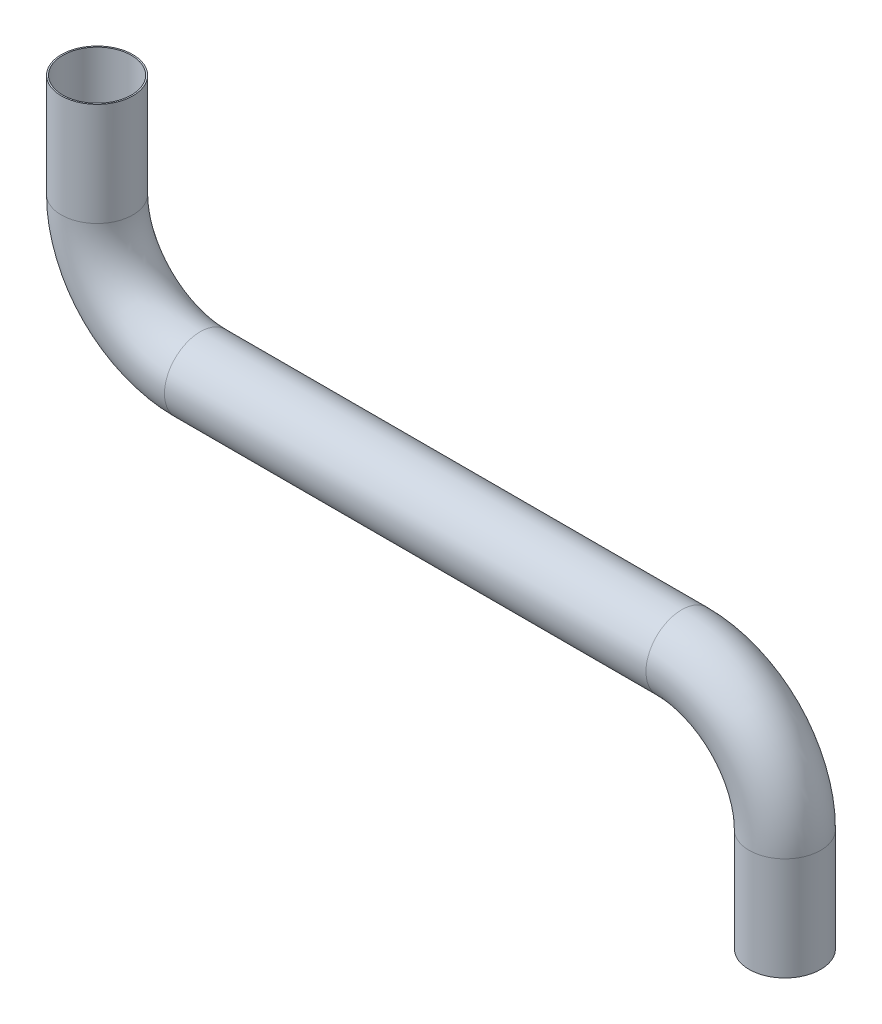
ISO-10303-21;
HEADER;
FILE_DESCRIPTION(('STEP AP214'),'2;1');
FILE_NAME('part.step','',(''),(''),'','','');
FILE_SCHEMA(('AUTOMOTIVE_DESIGN { 1 0 10303 214 1 1 1 1 }'));
ENDSEC;
DATA;
#1=APPLICATION_CONTEXT('core data for automotive mechanical design processes');
#2=APPLICATION_PROTOCOL_DEFINITION('international standard','automotive_design',2000,#1);
#3=PRODUCT_CONTEXT('',#1,'mechanical');
#4=PRODUCT('Part','Part','',(#3));
#5=PRODUCT_RELATED_PRODUCT_CATEGORY('part','',(#4));
#6=PRODUCT_DEFINITION_FORMATION('','',#4);
#7=PRODUCT_DEFINITION_CONTEXT('part definition',#1,'design');
#8=PRODUCT_DEFINITION('design','',#6,#7);
#9=PRODUCT_DEFINITION_SHAPE('','',#8);
#10=(LENGTH_UNIT() NAMED_UNIT(*) SI_UNIT(.MILLI.,.METRE.));
#11=(NAMED_UNIT(*) PLANE_ANGLE_UNIT() SI_UNIT($,.RADIAN.));
#12=(NAMED_UNIT(*) SI_UNIT($,.STERADIAN.) SOLID_ANGLE_UNIT());
#13=UNCERTAINTY_MEASURE_WITH_UNIT(LENGTH_MEASURE(1.E-05),#10,'distance_accuracy_value','');
#14=(GEOMETRIC_REPRESENTATION_CONTEXT(3) GLOBAL_UNCERTAINTY_ASSIGNED_CONTEXT((#13)) GLOBAL_UNIT_ASSIGNED_CONTEXT((#10,
#11,#12)) REPRESENTATION_CONTEXT('',''));
#15=CARTESIAN_POINT('',(0.,0.,0.));
#16=DIRECTION('',(0.,0.,1.));
#17=DIRECTION('',(1.,0.,0.));
#18=AXIS2_PLACEMENT_3D('',#15,#16,#17);
#19=CARTESIAN_POINT('',(0.,0.,0.));
#20=DIRECTION('',(0.,1.,0.));
#21=DIRECTION('',(0.,0.,1.));
#22=AXIS2_PLACEMENT_3D('',#19,#20,#21);
#23=PLANE('',#22);
#24=CARTESIAN_POINT('',(0.,0.,0.));
#25=DIRECTION('',(0.,1.,0.));
#26=DIRECTION('',(0.,0.,1.));
#27=AXIS2_PLACEMENT_3D('',#24,#25,#26);
#28=CIRCLE('',#27,25.);
#29=CARTESIAN_POINT('',(0.,0.,25.));
#30=VERTEX_POINT('',#29);
#31=EDGE_CURVE('E207',#30,#30,#28,.T.);
#32=ORIENTED_EDGE('',*,*,#31,.F.);
#33=EDGE_LOOP('',(#32));
#34=FACE_BOUND('',#33,.T.);
#35=CARTESIAN_POINT('',(0.,0.,0.));
#36=DIRECTION('',(0.,1.,0.));
#37=DIRECTION('',(0.,0.,1.));
#38=AXIS2_PLACEMENT_3D('',#35,#36,#37);
#39=CIRCLE('',#38,26.);
#40=CARTESIAN_POINT('',(0.,0.,26.));
#41=VERTEX_POINT('',#40);
#42=EDGE_CURVE('E61',#41,#41,#39,.T.);
#43=ORIENTED_EDGE('',*,*,#42,.T.);
#44=EDGE_LOOP('',(#43));
#45=FACE_BOUND('',#44,.T.);
#46=ADVANCED_FACE('F39',(#34,#45),#23,.T.);
#47=CARTESIAN_POINT('',(500.,-300.,0.));
#48=DIRECTION('',(0.,1.,0.));
#49=DIRECTION('',(0.,0.,1.));
#50=AXIS2_PLACEMENT_3D('',#47,#48,#49);
#51=PLANE('',#50);
#52=CARTESIAN_POINT('',(500.,-300.,0.));
#53=DIRECTION('',(0.,1.,0.));
#54=DIRECTION('',(0.,0.,1.));
#55=AXIS2_PLACEMENT_3D('',#52,#53,#54);
#56=CIRCLE('',#55,25.);
#57=CARTESIAN_POINT('',(500.,-300.,25.));
#58=VERTEX_POINT('',#57);
#59=EDGE_CURVE('E65',#58,#58,#56,.T.);
#60=ORIENTED_EDGE('',*,*,#59,.T.);
#61=EDGE_LOOP('',(#60));
#62=FACE_BOUND('',#61,.T.);
#63=CARTESIAN_POINT('',(500.,-300.,0.));
#64=DIRECTION('',(0.,1.,0.));
#65=DIRECTION('',(0.,0.,1.));
#66=AXIS2_PLACEMENT_3D('',#63,#64,#65);
#67=CIRCLE('',#66,26.);
#68=CARTESIAN_POINT('',(500.,-300.,26.));
#69=VERTEX_POINT('',#68);
#70=EDGE_CURVE('E10',#69,#69,#67,.T.);
#71=ORIENTED_EDGE('',*,*,#70,.F.);
#72=EDGE_LOOP('',(#71));
#73=FACE_BOUND('',#72,.T.);
#74=ADVANCED_FACE('F129',(#62,#73),#51,.F.);
#75=CARTESIAN_POINT('',(0.,0.,0.));
#76=DIRECTION('',(0.,-1.,0.));
#77=DIRECTION('',(0.,0.,-1.));
#78=AXIS2_PLACEMENT_3D('',#75,#76,#77);
#79=CYLINDRICAL_SURFACE('',#78,26.);
#80=CARTESIAN_POINT('',(0.,-74.9999999999995,0.));
#81=DIRECTION('',(0.,-1.,0.));
#82=DIRECTION('',(0.,0.,-1.));
#83=AXIS2_PLACEMENT_3D('',#80,#81,#82);
#84=CIRCLE('',#83,26.);
#85=CARTESIAN_POINT('',(-26.,-74.9999999999993,0.));
#86=VERTEX_POINT('',#85);
#87=EDGE_CURVE('E64',#86,#86,#84,.F.);
#88=ORIENTED_EDGE('',*,*,#87,.T.);
#89=EDGE_LOOP('',(#88));
#90=FACE_BOUND('',#89,.T.);
#91=ORIENTED_EDGE('',*,*,#42,.F.);
#92=EDGE_LOOP('',(#91));
#93=FACE_BOUND('',#92,.T.);
#94=ADVANCED_FACE('F98',(#90,#93),#79,.T.);
#95=CARTESIAN_POINT('',(75.,-75.,0.));
#96=DIRECTION('',(0.,0.,1.));
#97=DIRECTION('',(1.,0.,0.));
#98=AXIS2_PLACEMENT_3D('',#95,#96,#97);
#99=TOROIDAL_SURFACE('',#98,75.,26.);
#100=CARTESIAN_POINT('',(75.0000000000005,-150.,0.));
#101=DIRECTION('',(-1.,0.,0.));
#102=DIRECTION('',(0.,-1.,0.));
#103=AXIS2_PLACEMENT_3D('',#100,#101,#102);
#104=CIRCLE('',#103,26.);
#105=CARTESIAN_POINT('',(75.0000000000007,-176.,0.));
#106=VERTEX_POINT('',#105);
#107=EDGE_CURVE('E58',#106,#106,#104,.T.);
#108=CARTESIAN_POINT('',(75.,-75.,0.));
#109=DIRECTION('',(0.,0.,1.));
#110=DIRECTION('',(1.,0.,0.));
#111=AXIS2_PLACEMENT_3D('',#108,#109,#110);
#112=CIRCLE('',#111,101.);
#113=EDGE_CURVE('',#86,#106,#112,.T.);
#114=ORIENTED_EDGE('',*,*,#87,.F.);
#115=ORIENTED_EDGE('',*,*,#107,.T.);
#116=ORIENTED_EDGE('',*,*,#113,.T.);
#117=ORIENTED_EDGE('',*,*,#113,.F.);
#118=EDGE_LOOP('',(#114,#116,#115,#117));
#119=FACE_BOUND('',#118,.T.);
#120=ADVANCED_FACE('F86',(#119),#99,.T.);
#121=CARTESIAN_POINT('',(75.0000000000005,-150.,0.));
#122=DIRECTION('',(1.,0.,0.));
#123=DIRECTION('',(0.,0.,-1.));
#124=AXIS2_PLACEMENT_3D('',#121,#122,#123);
#125=CYLINDRICAL_SURFACE('',#124,26.);
#126=CARTESIAN_POINT('',(424.999999999999,-150.,0.));
#127=DIRECTION('',(1.,0.,0.));
#128=DIRECTION('',(0.,0.,-1.));
#129=AXIS2_PLACEMENT_3D('',#126,#127,#128);
#130=CIRCLE('',#129,26.);
#131=CARTESIAN_POINT('',(424.999999999999,-124.,0.));
#132=VERTEX_POINT('',#131);
#133=EDGE_CURVE('E52',#132,#132,#130,.F.);
#134=ORIENTED_EDGE('',*,*,#133,.T.);
#135=EDGE_LOOP('',(#134));
#136=FACE_BOUND('',#135,.T.);
#137=ORIENTED_EDGE('',*,*,#107,.F.);
#138=EDGE_LOOP('',(#137));
#139=FACE_BOUND('',#138,.T.);
#140=ADVANCED_FACE('F89',(#136,#139),#125,.T.);
#141=CARTESIAN_POINT('',(425.,-225.,0.));
#142=DIRECTION('',(0.,0.,-1.));
#143=DIRECTION('',(-1.,0.,0.));
#144=AXIS2_PLACEMENT_3D('',#141,#142,#143);
#145=TOROIDAL_SURFACE('',#144,75.,26.);
#146=CARTESIAN_POINT('',(500.,-225.000000000001,0.));
#147=DIRECTION('',(0.,1.,0.));
#148=DIRECTION('',(-1.,0.,0.));
#149=AXIS2_PLACEMENT_3D('',#146,#147,#148);
#150=CIRCLE('',#149,26.);
#151=CARTESIAN_POINT('',(526.,-225.000000000001,0.));
#152=VERTEX_POINT('',#151);
#153=EDGE_CURVE('E47',#152,#152,#150,.T.);
#154=CARTESIAN_POINT('',(425.,-225.,0.));
#155=DIRECTION('',(0.,0.,-1.));
#156=DIRECTION('',(-1.,0.,0.));
#157=AXIS2_PLACEMENT_3D('',#154,#155,#156);
#158=CIRCLE('',#157,101.);
#159=EDGE_CURVE('',#132,#152,#158,.T.);
#160=ORIENTED_EDGE('',*,*,#133,.F.);
#161=ORIENTED_EDGE('',*,*,#153,.T.);
#162=ORIENTED_EDGE('',*,*,#159,.T.);
#163=ORIENTED_EDGE('',*,*,#159,.F.);
#164=EDGE_LOOP('',(#160,#162,#161,#163));
#165=FACE_BOUND('',#164,.T.);
#166=ADVANCED_FACE('F91',(#165),#145,.T.);
#167=CARTESIAN_POINT('',(500.,-225.000000000001,0.));
#168=DIRECTION('',(0.,-1.,0.));
#169=DIRECTION('',(0.,0.,-1.));
#170=AXIS2_PLACEMENT_3D('',#167,#168,#169);
#171=CYLINDRICAL_SURFACE('',#170,26.);
#172=ORIENTED_EDGE('',*,*,#70,.T.);
#173=EDGE_LOOP('',(#172));
#174=FACE_BOUND('',#173,.T.);
#175=ORIENTED_EDGE('',*,*,#153,.F.);
#176=EDGE_LOOP('',(#175));
#177=FACE_BOUND('',#176,.T.);
#178=ADVANCED_FACE('F41',(#174,#177),#171,.T.);
#179=CARTESIAN_POINT('',(0.,0.,0.));
#180=DIRECTION('',(0.,-1.,0.));
#181=DIRECTION('',(0.,0.,-1.));
#182=AXIS2_PLACEMENT_3D('',#179,#180,#181);
#183=CYLINDRICAL_SURFACE('',#182,25.);
#184=CARTESIAN_POINT('',(0.,-74.9999999999995,0.));
#185=DIRECTION('',(0.,1.,0.));
#186=DIRECTION('',(0.,0.,1.));
#187=AXIS2_PLACEMENT_3D('',#184,#185,#186);
#188=CIRCLE('',#187,25.);
#189=CARTESIAN_POINT('',(-25.,-74.9999999999993,0.));
#190=VERTEX_POINT('',#189);
#191=EDGE_CURVE('E209',#190,#190,#188,.T.);
#192=ORIENTED_EDGE('',*,*,#191,.F.);
#193=EDGE_LOOP('',(#192));
#194=FACE_BOUND('',#193,.T.);
#195=ORIENTED_EDGE('',*,*,#31,.T.);
#196=EDGE_LOOP('',(#195));
#197=FACE_BOUND('',#196,.T.);
#198=ADVANCED_FACE('F101',(#194,#197),#183,.F.);
#199=CARTESIAN_POINT('',(75.,-75.,0.));
#200=DIRECTION('',(0.,0.,1.));
#201=DIRECTION('',(1.,0.,0.));
#202=AXIS2_PLACEMENT_3D('',#199,#200,#201);
#203=TOROIDAL_SURFACE('',#202,75.,25.);
#204=CARTESIAN_POINT('',(75.0000000000005,-150.,0.));
#205=DIRECTION('',(-1.,0.,0.));
#206=DIRECTION('',(0.,0.,1.));
#207=AXIS2_PLACEMENT_3D('',#204,#205,#206);
#208=CIRCLE('',#207,25.);
#209=CARTESIAN_POINT('',(75.0000000000007,-175.,0.));
#210=VERTEX_POINT('',#209);
#211=EDGE_CURVE('E213',#210,#210,#208,.T.);
#212=CARTESIAN_POINT('',(75.,-75.,0.));
#213=DIRECTION('',(0.,0.,1.));
#214=DIRECTION('',(1.,0.,0.));
#215=AXIS2_PLACEMENT_3D('',#212,#213,#214);
#216=CIRCLE('',#215,100.);
#217=EDGE_CURVE('',#190,#210,#216,.T.);
#218=ORIENTED_EDGE('',*,*,#191,.T.);
#219=ORIENTED_EDGE('',*,*,#211,.F.);
#220=ORIENTED_EDGE('',*,*,#217,.T.);
#221=ORIENTED_EDGE('',*,*,#217,.F.);
#222=EDGE_LOOP('',(#218,#220,#219,#221));
#223=FACE_BOUND('',#222,.T.);
#224=ADVANCED_FACE('F105',(#223),#203,.F.);
#225=CARTESIAN_POINT('',(75.0000000000005,-150.,0.));
#226=DIRECTION('',(1.,0.,0.));
#227=DIRECTION('',(0.,0.,-1.));
#228=AXIS2_PLACEMENT_3D('',#225,#226,#227);
#229=CYLINDRICAL_SURFACE('',#228,25.);
#230=CARTESIAN_POINT('',(424.999999999999,-150.,0.));
#231=DIRECTION('',(-1.,0.,0.));
#232=DIRECTION('',(0.,0.,1.));
#233=AXIS2_PLACEMENT_3D('',#230,#231,#232);
#234=CIRCLE('',#233,25.);
#235=CARTESIAN_POINT('',(424.999999999999,-125.,0.));
#236=VERTEX_POINT('',#235);
#237=EDGE_CURVE('E79',#236,#236,#234,.T.);
#238=ORIENTED_EDGE('',*,*,#237,.F.);
#239=EDGE_LOOP('',(#238));
#240=FACE_BOUND('',#239,.T.);
#241=ORIENTED_EDGE('',*,*,#211,.T.);
#242=EDGE_LOOP('',(#241));
#243=FACE_BOUND('',#242,.T.);
#244=ADVANCED_FACE('F112',(#240,#243),#229,.F.);
#245=CARTESIAN_POINT('',(425.,-225.,0.));
#246=DIRECTION('',(0.,0.,-1.));
#247=DIRECTION('',(-1.,0.,0.));
#248=AXIS2_PLACEMENT_3D('',#245,#246,#247);
#249=TOROIDAL_SURFACE('',#248,75.,25.);
#250=CARTESIAN_POINT('',(500.,-225.000000000001,0.));
#251=DIRECTION('',(0.,1.,0.));
#252=DIRECTION('',(0.,0.,1.));
#253=AXIS2_PLACEMENT_3D('',#250,#251,#252);
#254=CIRCLE('',#253,25.);
#255=CARTESIAN_POINT('',(525.,-225.000000000001,0.));
#256=VERTEX_POINT('',#255);
#257=EDGE_CURVE('E73',#256,#256,#254,.T.);
#258=CARTESIAN_POINT('',(425.,-225.,0.));
#259=DIRECTION('',(0.,0.,-1.));
#260=DIRECTION('',(-1.,0.,0.));
#261=AXIS2_PLACEMENT_3D('',#258,#259,#260);
#262=CIRCLE('',#261,99.9999999999999);
#263=EDGE_CURVE('',#236,#256,#262,.T.);
#264=ORIENTED_EDGE('',*,*,#237,.T.);
#265=ORIENTED_EDGE('',*,*,#257,.F.);
#266=ORIENTED_EDGE('',*,*,#263,.T.);
#267=ORIENTED_EDGE('',*,*,#263,.F.);
#268=EDGE_LOOP('',(#264,#266,#265,#267));
#269=FACE_BOUND('',#268,.T.);
#270=ADVANCED_FACE('F120',(#269),#249,.F.);
#271=CARTESIAN_POINT('',(500.,-225.000000000001,0.));
#272=DIRECTION('',(0.,-1.,0.));
#273=DIRECTION('',(0.,0.,-1.));
#274=AXIS2_PLACEMENT_3D('',#271,#272,#273);
#275=CYLINDRICAL_SURFACE('',#274,25.);
#276=ORIENTED_EDGE('',*,*,#59,.F.);
#277=EDGE_LOOP('',(#276));
#278=FACE_BOUND('',#277,.T.);
#279=ORIENTED_EDGE('',*,*,#257,.T.);
#280=EDGE_LOOP('',(#279));
#281=FACE_BOUND('',#280,.T.);
#282=ADVANCED_FACE('F124',(#278,#281),#275,.F.);
#283=CLOSED_SHELL('',(#46,#74,#94,#120,#140,#166,#178,#198,#224,#244,#270,#282));
#284=MANIFOLD_SOLID_BREP('B2',#283);
#285=ADVANCED_BREP_SHAPE_REPRESENTATION('',(#18,#284),#14);
#286=SHAPE_DEFINITION_REPRESENTATION(#9,#285);
ENDSEC;
END-ISO-10303-21;
